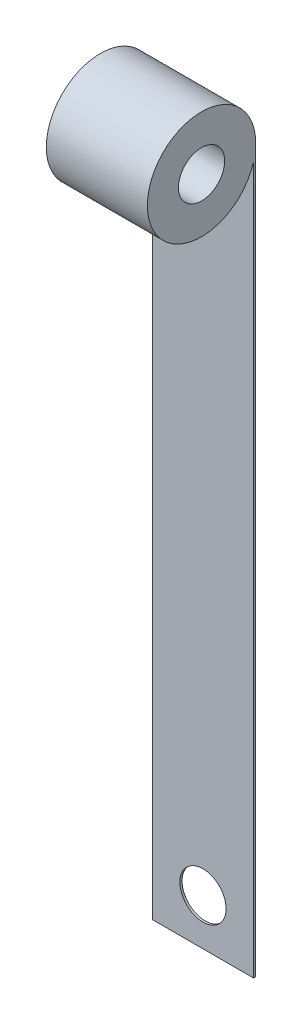
ISO-10303-21;
HEADER;
FILE_DESCRIPTION(('STEP AP214'),'2;1');
FILE_NAME('part.step','',(''),(''),'','','');
FILE_SCHEMA(('AUTOMOTIVE_DESIGN { 1 0 10303 214 1 1 1 1 }'));
ENDSEC;
DATA;
#1=APPLICATION_CONTEXT('core data for automotive mechanical design processes');
#2=APPLICATION_PROTOCOL_DEFINITION('international standard','automotive_design',2000,#1);
#3=PRODUCT_CONTEXT('',#1,'mechanical');
#4=PRODUCT('Part','Part','',(#3));
#5=PRODUCT_RELATED_PRODUCT_CATEGORY('part','',(#4));
#6=PRODUCT_DEFINITION_FORMATION('','',#4);
#7=PRODUCT_DEFINITION_CONTEXT('part definition',#1,'design');
#8=PRODUCT_DEFINITION('design','',#6,#7);
#9=PRODUCT_DEFINITION_SHAPE('','',#8);
#10=(LENGTH_UNIT() NAMED_UNIT(*) SI_UNIT(.MILLI.,.METRE.));
#11=(NAMED_UNIT(*) PLANE_ANGLE_UNIT() SI_UNIT($,.RADIAN.));
#12=(NAMED_UNIT(*) SI_UNIT($,.STERADIAN.) SOLID_ANGLE_UNIT());
#13=UNCERTAINTY_MEASURE_WITH_UNIT(LENGTH_MEASURE(1.E-05),#10,'distance_accuracy_value','');
#14=(GEOMETRIC_REPRESENTATION_CONTEXT(3) GLOBAL_UNCERTAINTY_ASSIGNED_CONTEXT((#13)) GLOBAL_UNIT_ASSIGNED_CONTEXT((#10,
#11,#12)) REPRESENTATION_CONTEXT('',''));
#15=CARTESIAN_POINT('',(0.,0.,0.));
#16=DIRECTION('',(0.,0.,1.));
#17=DIRECTION('',(1.,0.,0.));
#18=AXIS2_PLACEMENT_3D('',#15,#16,#17);
#19=CARTESIAN_POINT('',(7.,0.,0.));
#20=DIRECTION('',(1.,0.,0.));
#21=DIRECTION('',(0.,0.,-1.));
#22=AXIS2_PLACEMENT_3D('',#19,#20,#21);
#23=PLANE('',#22);
#24=CARTESIAN_POINT('',(7.,0.,0.));
#25=DIRECTION('',(1.,0.,0.));
#26=DIRECTION('',(0.,0.,-1.));
#27=AXIS2_PLACEMENT_3D('',#24,#25,#26);
#28=CIRCLE('',#27,3.75);
#29=CARTESIAN_POINT('',(7.,0.,-3.75));
#30=VERTEX_POINT('',#29);
#31=CARTESIAN_POINT('',(7.,-1.05,-3.6));
#32=VERTEX_POINT('',#31);
#33=EDGE_CURVE('E47',#30,#32,#28,.T.);
#34=ORIENTED_EDGE('',*,*,#33,.T.);
#35=DIRECTION('',(0.,1.,0.));
#36=VECTOR('',#35,1.);
#37=CARTESIAN_POINT('',(7.,-50.,-3.6));
#38=LINE('',#37,#36);
#39=CARTESIAN_POINT('',(7.,-50.,-3.6));
#40=VERTEX_POINT('',#39);
#41=EDGE_CURVE('E62',#40,#32,#38,.T.);
#42=ORIENTED_EDGE('',*,*,#41,.F.);
#43=DIRECTION('',(0.,0.,-1.));
#44=VECTOR('',#43,1.);
#45=CARTESIAN_POINT('',(7.,-50.,-3.75));
#46=LINE('',#45,#44);
#47=CARTESIAN_POINT('',(7.,-50.,-3.75));
#48=VERTEX_POINT('',#47);
#49=EDGE_CURVE('E95',#40,#48,#46,.T.);
#50=ORIENTED_EDGE('',*,*,#49,.T.);
#51=DIRECTION('',(0.,1.,0.));
#52=VECTOR('',#51,1.);
#53=CARTESIAN_POINT('',(7.,-50.,-3.75));
#54=LINE('',#53,#52);
#55=EDGE_CURVE('E111',#48,#30,#54,.T.);
#56=ORIENTED_EDGE('',*,*,#55,.T.);
#57=EDGE_LOOP('',(#34,#42,#50,#56));
#58=FACE_BOUND('',#57,.T.);
#59=CARTESIAN_POINT('',(7.,0.,0.));
#60=DIRECTION('',(1.,0.,0.));
#61=DIRECTION('',(0.,0.,-1.));
#62=AXIS2_PLACEMENT_3D('',#59,#60,#61);
#63=CIRCLE('',#62,1.6);
#64=CARTESIAN_POINT('',(7.,0.,-1.6));
#65=VERTEX_POINT('',#64);
#66=EDGE_CURVE('E114',#65,#65,#63,.T.);
#67=ORIENTED_EDGE('',*,*,#66,.F.);
#68=EDGE_LOOP('',(#67));
#69=FACE_BOUND('',#68,.T.);
#70=ADVANCED_FACE('F39',(#58,#69),#23,.T.);
#71=CARTESIAN_POINT('',(0.,0.,0.));
#72=DIRECTION('',(1.,0.,0.));
#73=DIRECTION('',(0.,0.,-1.));
#74=AXIS2_PLACEMENT_3D('',#71,#72,#73);
#75=PLANE('',#74);
#76=DIRECTION('',(0.,1.,0.));
#77=VECTOR('',#76,1.);
#78=CARTESIAN_POINT('',(0.,-50.,-3.6));
#79=LINE('',#78,#77);
#80=CARTESIAN_POINT('',(0.,-50.,-3.6));
#81=VERTEX_POINT('',#80);
#82=CARTESIAN_POINT('',(0.,-1.05,-3.6));
#83=VERTEX_POINT('',#82);
#84=EDGE_CURVE('E78',#81,#83,#79,.T.);
#85=ORIENTED_EDGE('',*,*,#84,.T.);
#86=CARTESIAN_POINT('',(0.,0.,0.));
#87=DIRECTION('',(1.,0.,0.));
#88=DIRECTION('',(0.,0.,-1.));
#89=AXIS2_PLACEMENT_3D('',#86,#87,#88);
#90=CIRCLE('',#89,3.75);
#91=CARTESIAN_POINT('',(0.,0.,-3.75));
#92=VERTEX_POINT('',#91);
#93=EDGE_CURVE('E117',#92,#83,#90,.T.);
#94=ORIENTED_EDGE('',*,*,#93,.F.);
#95=DIRECTION('',(0.,1.,0.));
#96=VECTOR('',#95,1.);
#97=CARTESIAN_POINT('',(0.,-50.,-3.75));
#98=LINE('',#97,#96);
#99=CARTESIAN_POINT('',(0.,-50.,-3.75));
#100=VERTEX_POINT('',#99);
#101=EDGE_CURVE('E54',#100,#92,#98,.T.);
#102=ORIENTED_EDGE('',*,*,#101,.F.);
#103=DIRECTION('',(0.,0.,1.));
#104=VECTOR('',#103,1.);
#105=CARTESIAN_POINT('',(0.,-50.,-3.75));
#106=LINE('',#105,#104);
#107=EDGE_CURVE('E93',#100,#81,#106,.T.);
#108=ORIENTED_EDGE('',*,*,#107,.T.);
#109=EDGE_LOOP('',(#85,#94,#102,#108));
#110=FACE_BOUND('',#109,.T.);
#111=CARTESIAN_POINT('',(0.,0.,0.));
#112=DIRECTION('',(1.,0.,0.));
#113=DIRECTION('',(0.,0.,-1.));
#114=AXIS2_PLACEMENT_3D('',#111,#112,#113);
#115=CIRCLE('',#114,1.6);
#116=CARTESIAN_POINT('',(0.,0.,-1.6));
#117=VERTEX_POINT('',#116);
#118=EDGE_CURVE('E110',#117,#117,#115,.T.);
#119=ORIENTED_EDGE('',*,*,#118,.T.);
#120=EDGE_LOOP('',(#119));
#121=FACE_BOUND('',#120,.T.);
#122=ADVANCED_FACE('F97',(#110,#121),#75,.F.);
#123=CARTESIAN_POINT('',(7.,0.,0.));
#124=DIRECTION('',(-1.,0.,0.));
#125=DIRECTION('',(0.,0.,1.));
#126=AXIS2_PLACEMENT_3D('',#123,#124,#125);
#127=CYLINDRICAL_SURFACE('',#126,3.75);
#128=ORIENTED_EDGE('',*,*,#93,.T.);
#129=DIRECTION('',(-1.,0.,0.));
#130=VECTOR('',#129,1.);
#131=CARTESIAN_POINT('',(7.,-1.05,-3.6));
#132=LINE('',#131,#130);
#133=EDGE_CURVE('E11',#83,#32,#132,.F.);
#134=ORIENTED_EDGE('',*,*,#133,.T.);
#135=ORIENTED_EDGE('',*,*,#33,.F.);
#136=DIRECTION('',(-1.,0.,0.));
#137=VECTOR('',#136,1.);
#138=CARTESIAN_POINT('',(0.,0.,-3.75));
#139=LINE('',#138,#137);
#140=EDGE_CURVE('E99',#30,#92,#139,.T.);
#141=ORIENTED_EDGE('',*,*,#140,.T.);
#142=EDGE_LOOP('',(#128,#134,#135,#141));
#143=FACE_BOUND('',#142,.T.);
#144=ADVANCED_FACE('F41',(#143),#127,.T.);
#145=CARTESIAN_POINT('',(7.,0.,0.));
#146=DIRECTION('',(-1.,0.,0.));
#147=DIRECTION('',(0.,0.,1.));
#148=AXIS2_PLACEMENT_3D('',#145,#146,#147);
#149=CYLINDRICAL_SURFACE('',#148,1.6);
#150=ORIENTED_EDGE('',*,*,#66,.T.);
#151=EDGE_LOOP('',(#150));
#152=FACE_BOUND('',#151,.T.);
#153=ORIENTED_EDGE('',*,*,#118,.F.);
#154=EDGE_LOOP('',(#153));
#155=FACE_BOUND('',#154,.T.);
#156=ADVANCED_FACE('F130',(#152,#155),#149,.F.);
#157=CARTESIAN_POINT('',(0.,-50.,-3.6));
#158=DIRECTION('',(0.,0.,1.));
#159=DIRECTION('',(1.,0.,0.));
#160=AXIS2_PLACEMENT_3D('',#157,#158,#159);
#161=PLANE('',#160);
#162=CARTESIAN_POINT('',(3.5,-46.8,-3.6));
#163=DIRECTION('',(0.,0.,1.));
#164=DIRECTION('',(1.,0.,0.));
#165=AXIS2_PLACEMENT_3D('',#162,#163,#164);
#166=CIRCLE('',#165,1.6);
#167=CARTESIAN_POINT('',(5.1,-46.8,-3.6));
#168=VERTEX_POINT('',#167);
#169=EDGE_CURVE('E104',#168,#168,#166,.T.);
#170=ORIENTED_EDGE('',*,*,#169,.F.);
#171=EDGE_LOOP('',(#170));
#172=FACE_BOUND('',#171,.T.);
#173=ORIENTED_EDGE('',*,*,#133,.F.);
#174=ORIENTED_EDGE('',*,*,#84,.F.);
#175=DIRECTION('',(1.,0.,0.));
#176=VECTOR('',#175,1.);
#177=CARTESIAN_POINT('',(0.,-50.,-3.6));
#178=LINE('',#177,#176);
#179=EDGE_CURVE('E81',#81,#40,#178,.T.);
#180=ORIENTED_EDGE('',*,*,#179,.T.);
#181=ORIENTED_EDGE('',*,*,#41,.T.);
#182=EDGE_LOOP('',(#173,#174,#180,#181));
#183=FACE_BOUND('',#182,.T.);
#184=ADVANCED_FACE('F80',(#172,#183),#161,.T.);
#185=CARTESIAN_POINT('',(0.,-50.,-3.75));
#186=DIRECTION('',(0.,0.,-1.));
#187=DIRECTION('',(-1.,0.,0.));
#188=AXIS2_PLACEMENT_3D('',#185,#186,#187);
#189=PLANE('',#188);
#190=CARTESIAN_POINT('',(3.5,-46.8,-3.75));
#191=DIRECTION('',(0.,0.,1.));
#192=DIRECTION('',(1.,0.,0.));
#193=AXIS2_PLACEMENT_3D('',#190,#191,#192);
#194=CIRCLE('',#193,1.6);
#195=CARTESIAN_POINT('',(5.1,-46.8,-3.75));
#196=VERTEX_POINT('',#195);
#197=EDGE_CURVE('E101',#196,#196,#194,.T.);
#198=ORIENTED_EDGE('',*,*,#197,.T.);
#199=EDGE_LOOP('',(#198));
#200=FACE_BOUND('',#199,.T.);
#201=ORIENTED_EDGE('',*,*,#140,.F.);
#202=ORIENTED_EDGE('',*,*,#55,.F.);
#203=DIRECTION('',(-1.,0.,0.));
#204=VECTOR('',#203,1.);
#205=CARTESIAN_POINT('',(0.,-50.,-3.75));
#206=LINE('',#205,#204);
#207=EDGE_CURVE('E86',#48,#100,#206,.T.);
#208=ORIENTED_EDGE('',*,*,#207,.T.);
#209=ORIENTED_EDGE('',*,*,#101,.T.);
#210=EDGE_LOOP('',(#201,#202,#208,#209));
#211=FACE_BOUND('',#210,.T.);
#212=ADVANCED_FACE('F123',(#200,#211),#189,.T.);
#213=CARTESIAN_POINT('',(0.,-50.,0.));
#214=DIRECTION('',(0.,1.,0.));
#215=DIRECTION('',(0.,0.,1.));
#216=AXIS2_PLACEMENT_3D('',#213,#214,#215);
#217=PLANE('',#216);
#218=ORIENTED_EDGE('',*,*,#107,.F.);
#219=ORIENTED_EDGE('',*,*,#207,.F.);
#220=ORIENTED_EDGE('',*,*,#49,.F.);
#221=ORIENTED_EDGE('',*,*,#179,.F.);
#222=EDGE_LOOP('',(#218,#219,#220,#221));
#223=FACE_BOUND('',#222,.T.);
#224=ADVANCED_FACE('F91',(#223),#217,.F.);
#225=CARTESIAN_POINT('',(3.5,-46.8,-3.75));
#226=DIRECTION('',(0.,0.,1.));
#227=DIRECTION('',(1.,0.,0.));
#228=AXIS2_PLACEMENT_3D('',#225,#226,#227);
#229=CYLINDRICAL_SURFACE('',#228,1.6);
#230=ORIENTED_EDGE('',*,*,#197,.F.);
#231=EDGE_LOOP('',(#230));
#232=FACE_BOUND('',#231,.T.);
#233=ORIENTED_EDGE('',*,*,#169,.T.);
#234=EDGE_LOOP('',(#233));
#235=FACE_BOUND('',#234,.T.);
#236=ADVANCED_FACE('F148',(#232,#235),#229,.F.);
#237=CLOSED_SHELL('',(#70,#122,#144,#156,#184,#212,#224,#236));
#238=MANIFOLD_SOLID_BREP('B2',#237);
#239=ADVANCED_BREP_SHAPE_REPRESENTATION('',(#18,#238),#14);
#240=SHAPE_DEFINITION_REPRESENTATION(#9,#239);
ENDSEC;
END-ISO-10303-21;
